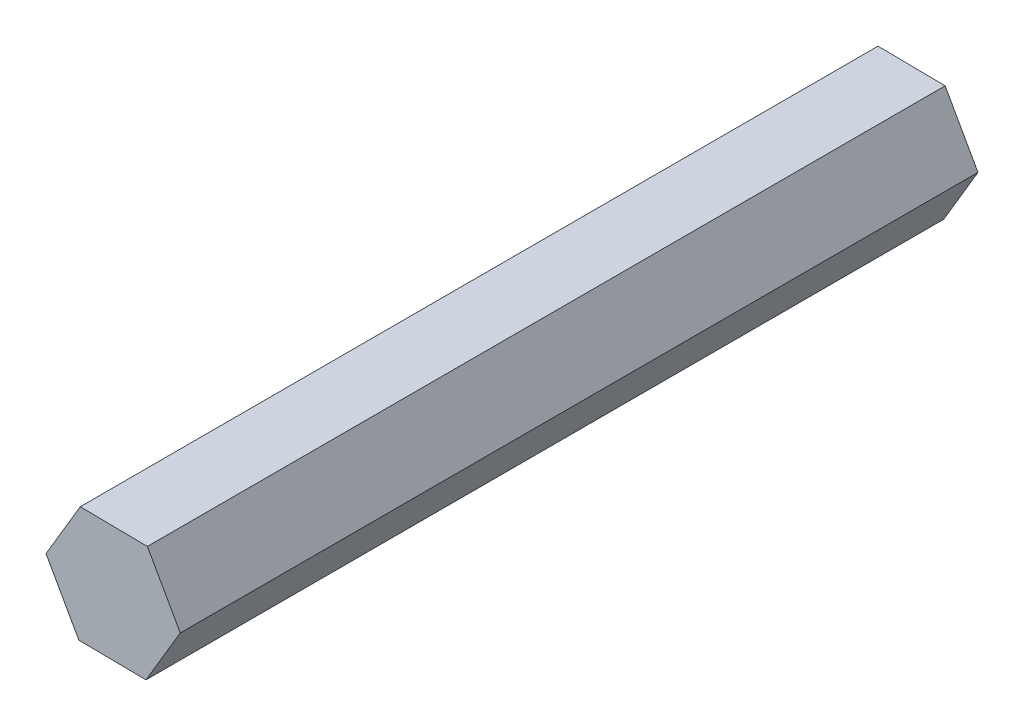
ISO-10303-21;
HEADER;
FILE_DESCRIPTION(('STEP AP214'),'2;1');
FILE_NAME('part.step','',(''),(''),'','','');
FILE_SCHEMA(('AUTOMOTIVE_DESIGN { 1 0 10303 214 1 1 1 1 }'));
ENDSEC;
DATA;
#1=APPLICATION_CONTEXT('core data for automotive mechanical design processes');
#2=APPLICATION_PROTOCOL_DEFINITION('international standard','automotive_design',2000,#1);
#3=PRODUCT_CONTEXT('',#1,'mechanical');
#4=PRODUCT('Part','Part','',(#3));
#5=PRODUCT_RELATED_PRODUCT_CATEGORY('part','',(#4));
#6=PRODUCT_DEFINITION_FORMATION('','',#4);
#7=PRODUCT_DEFINITION_CONTEXT('part definition',#1,'design');
#8=PRODUCT_DEFINITION('design','',#6,#7);
#9=PRODUCT_DEFINITION_SHAPE('','',#8);
#10=(LENGTH_UNIT() NAMED_UNIT(*) SI_UNIT(.MILLI.,.METRE.));
#11=(NAMED_UNIT(*) PLANE_ANGLE_UNIT() SI_UNIT($,.RADIAN.));
#12=(NAMED_UNIT(*) SI_UNIT($,.STERADIAN.) SOLID_ANGLE_UNIT());
#13=UNCERTAINTY_MEASURE_WITH_UNIT(LENGTH_MEASURE(1.E-05),#10,'distance_accuracy_value','');
#14=(GEOMETRIC_REPRESENTATION_CONTEXT(3) GLOBAL_UNCERTAINTY_ASSIGNED_CONTEXT((#13)) GLOBAL_UNIT_ASSIGNED_CONTEXT((#10,
#11,#12)) REPRESENTATION_CONTEXT('',''));
#15=CARTESIAN_POINT('',(0.,0.,0.));
#16=DIRECTION('',(0.,0.,1.));
#17=DIRECTION('',(1.,0.,0.));
#18=AXIS2_PLACEMENT_3D('',#15,#16,#17);
#19=CARTESIAN_POINT('',(5.49886117806557,-0.0663381064198323,65.3542));
#20=DIRECTION('',(-0.871993937270013,-0.489516673224049,0.));
#21=DIRECTION('',(0.489516673224049,-0.871993937270013,0.));
#22=AXIS2_PLACEMENT_3D('',#19,#20,#21);
#23=PLANE('',#22);
#24=DIRECTION('',(-0.489516673224049,0.871993937270013,0.));
#25=VECTOR('',#24,1.);
#26=CARTESIAN_POINT('',(5.49886117806557,-0.0663381064198323,0.));
#27=LINE('',#26,#25);
#28=CARTESIAN_POINT('',(5.49886117806557,-0.0663381064198323,0.));
#29=VERTEX_POINT('',#28);
#30=CARTESIAN_POINT('',(2.80688107443131,4.72898441887889,0.));
#31=VERTEX_POINT('',#30);
#32=EDGE_CURVE('E116',#29,#31,#27,.T.);
#33=ORIENTED_EDGE('',*,*,#32,.T.);
#34=DIRECTION('',(0.,0.,-1.));
#35=VECTOR('',#34,1.);
#36=CARTESIAN_POINT('',(2.80688107443131,4.72898441887889,65.3542));
#37=LINE('',#36,#35);
#38=CARTESIAN_POINT('',(2.80688107443131,4.72898441887889,65.3542));
#39=VERTEX_POINT('',#38);
#40=EDGE_CURVE('E11',#39,#31,#37,.T.);
#41=ORIENTED_EDGE('',*,*,#40,.F.);
#42=DIRECTION('',(-0.489516673224049,0.871993937270013,0.));
#43=VECTOR('',#42,1.);
#44=CARTESIAN_POINT('',(5.49886117806557,-0.0663381064198323,65.3542));
#45=LINE('',#44,#43);
#46=CARTESIAN_POINT('',(5.49886117806557,-0.0663381064198323,65.3542));
#47=VERTEX_POINT('',#46);
#48=EDGE_CURVE('E126',#47,#39,#45,.T.);
#49=ORIENTED_EDGE('',*,*,#48,.F.);
#50=DIRECTION('',(0.,0.,-1.));
#51=VECTOR('',#50,1.);
#52=CARTESIAN_POINT('',(5.49886117806557,-0.0663381064198323,65.3542));
#53=LINE('',#52,#51);
#54=EDGE_CURVE('E112',#47,#29,#53,.T.);
#55=ORIENTED_EDGE('',*,*,#54,.T.);
#56=EDGE_LOOP('',(#33,#41,#49,#55));
#57=FACE_BOUND('',#56,.T.);
#58=ADVANCED_FACE('F32',(#57),#23,.F.);
#59=CARTESIAN_POINT('',(2.80688107443131,4.72898441887889,65.3542));
#60=DIRECTION('',(-0.0120630940469348,-0.99992723823387,0.));
#61=DIRECTION('',(0.99992723823387,-0.0120630940469348,0.));
#62=AXIS2_PLACEMENT_3D('',#59,#60,#61);
#63=PLANE('',#62);
#64=DIRECTION('',(-0.99992723823387,0.0120630940469348,0.));
#65=VECTOR('',#64,1.);
#66=CARTESIAN_POINT('',(2.80688107443131,4.72898441887889,0.));
#67=LINE('',#66,#65);
#68=CARTESIAN_POINT('',(-2.69198010363425,4.79532252529872,0.));
#69=VERTEX_POINT('',#68);
#70=EDGE_CURVE('E119',#31,#69,#67,.T.);
#71=ORIENTED_EDGE('',*,*,#70,.T.);
#72=DIRECTION('',(0.,0.,-1.));
#73=VECTOR('',#72,1.);
#74=CARTESIAN_POINT('',(-2.69198010363425,4.79532252529872,65.3542));
#75=LINE('',#74,#73);
#76=CARTESIAN_POINT('',(-2.69198010363425,4.79532252529872,65.3542));
#77=VERTEX_POINT('',#76);
#78=EDGE_CURVE('E40',#77,#69,#75,.T.);
#79=ORIENTED_EDGE('',*,*,#78,.F.);
#80=DIRECTION('',(-0.99992723823387,0.0120630940469348,0.));
#81=VECTOR('',#80,1.);
#82=CARTESIAN_POINT('',(2.80688107443131,4.72898441887889,65.3542));
#83=LINE('',#82,#81);
#84=EDGE_CURVE('E85',#39,#77,#83,.T.);
#85=ORIENTED_EDGE('',*,*,#84,.F.);
#86=ORIENTED_EDGE('',*,*,#40,.T.);
#87=EDGE_LOOP('',(#71,#79,#85,#86));
#88=FACE_BOUND('',#87,.T.);
#89=ADVANCED_FACE('F150',(#88),#63,.F.);
#90=CARTESIAN_POINT('',(-2.69198010363425,4.79532252529872,65.3542));
#91=DIRECTION('',(0.859930843223078,-0.510410565009822,0.));
#92=DIRECTION('',(0.510410565009822,0.859930843223078,0.));
#93=AXIS2_PLACEMENT_3D('',#90,#91,#92);
#94=PLANE('',#93);
#95=DIRECTION('',(-0.510410565009822,-0.859930843223078,0.));
#96=VECTOR('',#95,1.);
#97=CARTESIAN_POINT('',(-2.69198010363425,4.79532252529872,0.));
#98=LINE('',#97,#96);
#99=CARTESIAN_POINT('',(-5.49886117806557,0.0663381064198295,0.));
#100=VERTEX_POINT('',#99);
#101=EDGE_CURVE('E121',#69,#100,#98,.T.);
#102=ORIENTED_EDGE('',*,*,#101,.T.);
#103=DIRECTION('',(0.,0.,-1.));
#104=VECTOR('',#103,1.);
#105=CARTESIAN_POINT('',(-5.49886117806557,0.0663381064198295,65.3542));
#106=LINE('',#105,#104);
#107=CARTESIAN_POINT('',(-5.49886117806557,0.0663381064198295,65.3542));
#108=VERTEX_POINT('',#107);
#109=EDGE_CURVE('E107',#108,#100,#106,.T.);
#110=ORIENTED_EDGE('',*,*,#109,.F.);
#111=DIRECTION('',(-0.510410565009822,-0.859930843223078,0.));
#112=VECTOR('',#111,1.);
#113=CARTESIAN_POINT('',(-2.69198010363425,4.79532252529872,65.3542));
#114=LINE('',#113,#112);
#115=EDGE_CURVE('E98',#77,#108,#114,.T.);
#116=ORIENTED_EDGE('',*,*,#115,.F.);
#117=ORIENTED_EDGE('',*,*,#78,.T.);
#118=EDGE_LOOP('',(#102,#110,#116,#117));
#119=FACE_BOUND('',#118,.T.);
#120=ADVANCED_FACE('F132',(#119),#94,.F.);
#121=CARTESIAN_POINT('',(-5.49886117806557,0.0663381064198295,65.3542));
#122=DIRECTION('',(0.871993937270013,0.489516673224049,0.));
#123=DIRECTION('',(-0.489516673224049,0.871993937270013,0.));
#124=AXIS2_PLACEMENT_3D('',#121,#122,#123);
#125=PLANE('',#124);
#126=DIRECTION('',(0.489516673224049,-0.871993937270013,0.));
#127=VECTOR('',#126,1.);
#128=CARTESIAN_POINT('',(-5.49886117806557,0.0663381064198295,0.));
#129=LINE('',#128,#127);
#130=CARTESIAN_POINT('',(-2.80688107443131,-4.72898441887889,0.));
#131=VERTEX_POINT('',#130);
#132=EDGE_CURVE('E106',#100,#131,#129,.T.);
#133=ORIENTED_EDGE('',*,*,#132,.T.);
#134=DIRECTION('',(0.,0.,-1.));
#135=VECTOR('',#134,1.);
#136=CARTESIAN_POINT('',(-2.80688107443131,-4.72898441887889,65.3542));
#137=LINE('',#136,#135);
#138=CARTESIAN_POINT('',(-2.80688107443131,-4.72898441887889,65.3542));
#139=VERTEX_POINT('',#138);
#140=EDGE_CURVE('E103',#139,#131,#137,.T.);
#141=ORIENTED_EDGE('',*,*,#140,.F.);
#142=DIRECTION('',(0.489516673224049,-0.871993937270013,0.));
#143=VECTOR('',#142,1.);
#144=CARTESIAN_POINT('',(-5.49886117806557,0.0663381064198295,65.3542));
#145=LINE('',#144,#143);
#146=EDGE_CURVE('E92',#108,#139,#145,.T.);
#147=ORIENTED_EDGE('',*,*,#146,.F.);
#148=ORIENTED_EDGE('',*,*,#109,.T.);
#149=EDGE_LOOP('',(#133,#141,#147,#148));
#150=FACE_BOUND('',#149,.T.);
#151=ADVANCED_FACE('F104',(#150),#125,.F.);
#152=CARTESIAN_POINT('',(-2.80688107443131,-4.72898441887889,65.3542));
#153=DIRECTION('',(0.0120630940469353,0.99992723823387,0.));
#154=DIRECTION('',(-0.99992723823387,0.0120630940469353,0.));
#155=AXIS2_PLACEMENT_3D('',#152,#153,#154);
#156=PLANE('',#155);
#157=DIRECTION('',(0.99992723823387,-0.0120630940469353,0.));
#158=VECTOR('',#157,1.);
#159=CARTESIAN_POINT('',(-2.80688107443131,-4.72898441887889,0.));
#160=LINE('',#159,#158);
#161=CARTESIAN_POINT('',(2.69198010363426,-4.79532252529872,0.));
#162=VERTEX_POINT('',#161);
#163=EDGE_CURVE('E71',#131,#162,#160,.T.);
#164=ORIENTED_EDGE('',*,*,#163,.T.);
#165=DIRECTION('',(0.,0.,-1.));
#166=VECTOR('',#165,1.);
#167=CARTESIAN_POINT('',(2.69198010363426,-4.79532252529872,65.3542));
#168=LINE('',#167,#166);
#169=CARTESIAN_POINT('',(2.69198010363426,-4.79532252529872,65.3542));
#170=VERTEX_POINT('',#169);
#171=EDGE_CURVE('E108',#170,#162,#168,.T.);
#172=ORIENTED_EDGE('',*,*,#171,.F.);
#173=DIRECTION('',(0.99992723823387,-0.0120630940469353,0.));
#174=VECTOR('',#173,1.);
#175=CARTESIAN_POINT('',(-2.80688107443131,-4.72898441887889,65.3542));
#176=LINE('',#175,#174);
#177=EDGE_CURVE('E96',#139,#170,#176,.T.);
#178=ORIENTED_EDGE('',*,*,#177,.F.);
#179=ORIENTED_EDGE('',*,*,#140,.T.);
#180=EDGE_LOOP('',(#164,#172,#178,#179));
#181=FACE_BOUND('',#180,.T.);
#182=ADVANCED_FACE('F110',(#181),#156,.F.);
#183=CARTESIAN_POINT('',(2.69198010363426,-4.79532252529872,65.3542));
#184=DIRECTION('',(-0.859930843223078,0.510410565009822,0.));
#185=DIRECTION('',(-0.510410565009822,-0.859930843223078,0.));
#186=AXIS2_PLACEMENT_3D('',#183,#184,#185);
#187=PLANE('',#186);
#188=DIRECTION('',(0.510410565009822,0.859930843223078,0.));
#189=VECTOR('',#188,1.);
#190=CARTESIAN_POINT('',(2.69198010363426,-4.79532252529872,0.));
#191=LINE('',#190,#189);
#192=EDGE_CURVE('E77',#162,#29,#191,.T.);
#193=ORIENTED_EDGE('',*,*,#192,.T.);
#194=ORIENTED_EDGE('',*,*,#54,.F.);
#195=DIRECTION('',(0.510410565009822,0.859930843223078,0.));
#196=VECTOR('',#195,1.);
#197=CARTESIAN_POINT('',(2.69198010363426,-4.79532252529872,65.3542));
#198=LINE('',#197,#196);
#199=EDGE_CURVE('E48',#170,#47,#198,.T.);
#200=ORIENTED_EDGE('',*,*,#199,.F.);
#201=ORIENTED_EDGE('',*,*,#171,.T.);
#202=EDGE_LOOP('',(#193,#194,#200,#201));
#203=FACE_BOUND('',#202,.T.);
#204=ADVANCED_FACE('F139',(#203),#187,.F.);
#205=CARTESIAN_POINT('',(0.,0.,65.3542));
#206=DIRECTION('',(0.,0.,1.));
#207=DIRECTION('',(1.,0.,0.));
#208=AXIS2_PLACEMENT_3D('',#205,#206,#207);
#209=PLANE('',#208);
#210=ORIENTED_EDGE('',*,*,#48,.T.);
#211=ORIENTED_EDGE('',*,*,#84,.T.);
#212=ORIENTED_EDGE('',*,*,#115,.T.);
#213=ORIENTED_EDGE('',*,*,#146,.T.);
#214=ORIENTED_EDGE('',*,*,#177,.T.);
#215=ORIENTED_EDGE('',*,*,#199,.T.);
#216=EDGE_LOOP('',(#210,#211,#212,#213,#214,#215));
#217=FACE_BOUND('',#216,.T.);
#218=ADVANCED_FACE('F94',(#217),#209,.T.);
#219=CARTESIAN_POINT('',(0.,0.,0.));
#220=DIRECTION('',(0.,0.,1.));
#221=DIRECTION('',(1.,0.,0.));
#222=AXIS2_PLACEMENT_3D('',#219,#220,#221);
#223=PLANE('',#222);
#224=ORIENTED_EDGE('',*,*,#32,.F.);
#225=ORIENTED_EDGE('',*,*,#192,.F.);
#226=ORIENTED_EDGE('',*,*,#163,.F.);
#227=ORIENTED_EDGE('',*,*,#132,.F.);
#228=ORIENTED_EDGE('',*,*,#101,.F.);
#229=ORIENTED_EDGE('',*,*,#70,.F.);
#230=EDGE_LOOP('',(#224,#225,#226,#227,#228,#229));
#231=FACE_BOUND('',#230,.T.);
#232=ADVANCED_FACE('F135',(#231),#223,.F.);
#233=CLOSED_SHELL('',(#58,#89,#120,#151,#182,#204,#218,#232));
#234=MANIFOLD_SOLID_BREP('B2',#233);
#235=ADVANCED_BREP_SHAPE_REPRESENTATION('',(#18,#234),#14);
#236=SHAPE_DEFINITION_REPRESENTATION(#9,#235);
ENDSEC;
END-ISO-10303-21;
